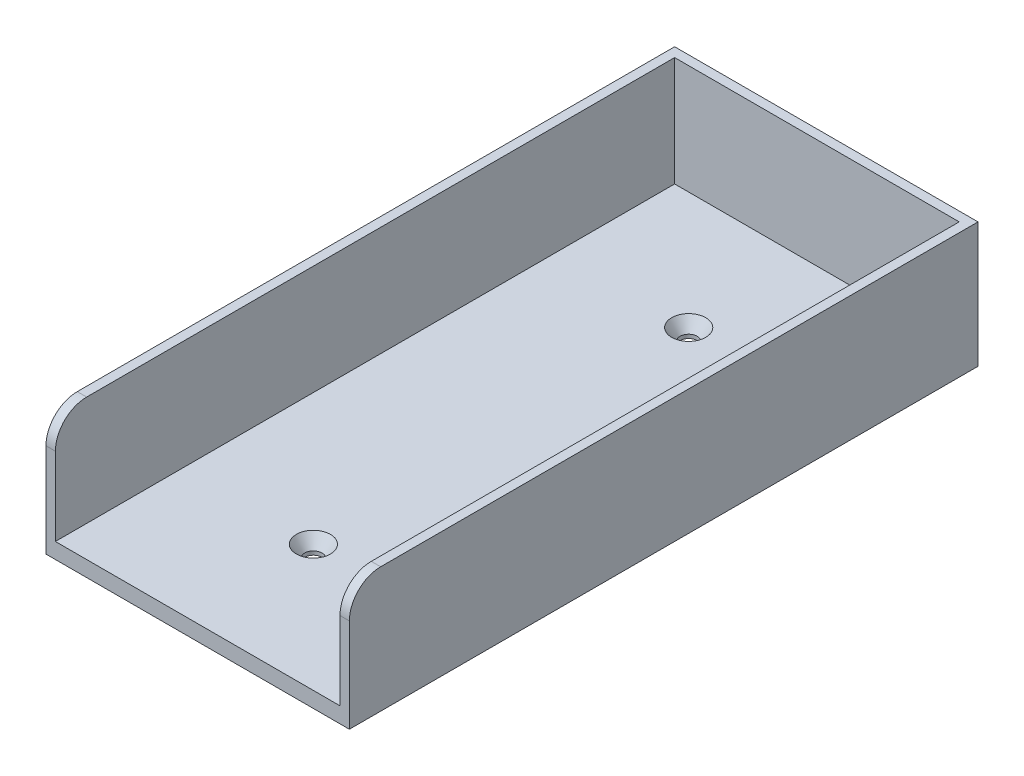
ISO-10303-21;
HEADER;
FILE_DESCRIPTION(('STEP AP214'),'2;1');
FILE_NAME('part.step','',(''),(''),'','','');
FILE_SCHEMA(('AUTOMOTIVE_DESIGN { 1 0 10303 214 1 1 1 1 }'));
ENDSEC;
DATA;
#1=APPLICATION_CONTEXT('core data for automotive mechanical design processes');
#2=APPLICATION_PROTOCOL_DEFINITION('international standard','automotive_design',2000,#1);
#3=PRODUCT_CONTEXT('',#1,'mechanical');
#4=PRODUCT('Part','Part','',(#3));
#5=PRODUCT_RELATED_PRODUCT_CATEGORY('part','',(#4));
#6=PRODUCT_DEFINITION_FORMATION('','',#4);
#7=PRODUCT_DEFINITION_CONTEXT('part definition',#1,'design');
#8=PRODUCT_DEFINITION('design','',#6,#7);
#9=PRODUCT_DEFINITION_SHAPE('','',#8);
#10=(LENGTH_UNIT() NAMED_UNIT(*) SI_UNIT(.MILLI.,.METRE.));
#11=(NAMED_UNIT(*) PLANE_ANGLE_UNIT() SI_UNIT($,.RADIAN.));
#12=(NAMED_UNIT(*) SI_UNIT($,.STERADIAN.) SOLID_ANGLE_UNIT());
#13=UNCERTAINTY_MEASURE_WITH_UNIT(LENGTH_MEASURE(1.E-05),#10,'distance_accuracy_value','');
#14=(GEOMETRIC_REPRESENTATION_CONTEXT(3) GLOBAL_UNCERTAINTY_ASSIGNED_CONTEXT((#13)) GLOBAL_UNIT_ASSIGNED_CONTEXT((#10,
#11,#12)) REPRESENTATION_CONTEXT('',''));
#15=CARTESIAN_POINT('',(0.,0.,0.));
#16=DIRECTION('',(0.,0.,1.));
#17=DIRECTION('',(1.,0.,0.));
#18=AXIS2_PLACEMENT_3D('',#15,#16,#17);
#19=CARTESIAN_POINT('',(45.5,35.,97.5));
#20=DIRECTION('',(1.,0.,0.));
#21=DIRECTION('',(0.,0.,-1.));
#22=AXIS2_PLACEMENT_3D('',#19,#20,#21);
#23=PLANE('',#22);
#24=DIRECTION('',(0.,-1.,0.));
#25=VECTOR('',#24,1.);
#26=CARTESIAN_POINT('',(45.5,35.,100.5));
#27=LINE('',#26,#25);
#28=CARTESIAN_POINT('',(45.5,25.,100.5));
#29=VERTEX_POINT('',#28);
#30=CARTESIAN_POINT('',(45.5,0.,100.5));
#31=VERTEX_POINT('',#30);
#32=EDGE_CURVE('E187',#29,#31,#27,.T.);
#33=ORIENTED_EDGE('',*,*,#32,.F.);
#34=CARTESIAN_POINT('',(45.5,25.,90.5));
#35=DIRECTION('',(1.,0.,0.));
#36=DIRECTION('',(0.,0.,-1.));
#37=AXIS2_PLACEMENT_3D('',#34,#35,#36);
#38=CIRCLE('',#37,10.);
#39=CARTESIAN_POINT('',(45.5,35.,90.5));
#40=VERTEX_POINT('',#39);
#41=EDGE_CURVE('E200',#29,#40,#38,.F.);
#42=ORIENTED_EDGE('',*,*,#41,.T.);
#43=DIRECTION('',(0.,0.,1.));
#44=VECTOR('',#43,1.);
#45=CARTESIAN_POINT('',(45.5,35.,97.5));
#46=LINE('',#45,#44);
#47=CARTESIAN_POINT('',(45.5,35.,-97.5));
#48=VERTEX_POINT('',#47);
#49=EDGE_CURVE('E155',#48,#40,#46,.T.);
#50=ORIENTED_EDGE('',*,*,#49,.F.);
#51=DIRECTION('',(0.,-1.,0.));
#52=VECTOR('',#51,1.);
#53=CARTESIAN_POINT('',(45.5,35.,-97.5));
#54=LINE('',#53,#52);
#55=CARTESIAN_POINT('',(45.5,0.,-97.5));
#56=VERTEX_POINT('',#55);
#57=EDGE_CURVE('E168',#48,#56,#54,.T.);
#58=ORIENTED_EDGE('',*,*,#57,.T.);
#59=DIRECTION('',(0.,0.,1.));
#60=VECTOR('',#59,1.);
#61=CARTESIAN_POINT('',(45.5,0.,97.5));
#62=LINE('',#61,#60);
#63=EDGE_CURVE('E153',#56,#31,#62,.T.);
#64=ORIENTED_EDGE('',*,*,#63,.T.);
#65=EDGE_LOOP('',(#33,#42,#50,#58,#64));
#66=FACE_BOUND('',#65,.T.);
#67=ADVANCED_FACE('F38',(#66),#23,.F.);
#68=CARTESIAN_POINT('',(48.5,35.,100.5));
#69=DIRECTION('',(-1.,0.,0.));
#70=DIRECTION('',(0.,0.,1.));
#71=AXIS2_PLACEMENT_3D('',#68,#69,#70);
#72=PLANE('',#71);
#73=DIRECTION('',(0.,0.,-1.));
#74=VECTOR('',#73,1.);
#75=CARTESIAN_POINT('',(48.5,35.,100.5));
#76=LINE('',#75,#74);
#77=CARTESIAN_POINT('',(48.5,35.,90.5));
#78=VERTEX_POINT('',#77);
#79=CARTESIAN_POINT('',(48.5,35.,-100.5));
#80=VERTEX_POINT('',#79);
#81=EDGE_CURVE('E158',#78,#80,#76,.T.);
#82=ORIENTED_EDGE('',*,*,#81,.F.);
#83=CARTESIAN_POINT('',(48.5,25.,90.5));
#84=DIRECTION('',(-1.,0.,0.));
#85=DIRECTION('',(0.,0.,1.));
#86=AXIS2_PLACEMENT_3D('',#83,#84,#85);
#87=CIRCLE('',#86,10.);
#88=CARTESIAN_POINT('',(48.5,25.,100.5));
#89=VERTEX_POINT('',#88);
#90=EDGE_CURVE('E195',#78,#89,#87,.F.);
#91=ORIENTED_EDGE('',*,*,#90,.T.);
#92=DIRECTION('',(0.,-1.,0.));
#93=VECTOR('',#92,1.);
#94=CARTESIAN_POINT('',(48.5,35.,100.5));
#95=LINE('',#94,#93);
#96=CARTESIAN_POINT('',(48.5,-5.,100.5));
#97=VERTEX_POINT('',#96);
#98=EDGE_CURVE('E185',#89,#97,#95,.T.);
#99=ORIENTED_EDGE('',*,*,#98,.T.);
#100=DIRECTION('',(0.,0.,1.));
#101=VECTOR('',#100,1.);
#102=CARTESIAN_POINT('',(48.5,-5.,100.5));
#103=LINE('',#102,#101);
#104=CARTESIAN_POINT('',(48.5,-5.,-100.5));
#105=VERTEX_POINT('',#104);
#106=EDGE_CURVE('E138',#105,#97,#103,.T.);
#107=ORIENTED_EDGE('',*,*,#106,.F.);
#108=DIRECTION('',(0.,-1.,0.));
#109=VECTOR('',#108,1.);
#110=CARTESIAN_POINT('',(48.5,35.,-100.5));
#111=LINE('',#110,#109);
#112=EDGE_CURVE('E128',#80,#105,#111,.T.);
#113=ORIENTED_EDGE('',*,*,#112,.F.);
#114=EDGE_LOOP('',(#82,#91,#99,#107,#113));
#115=FACE_BOUND('',#114,.T.);
#116=ADVANCED_FACE('F225',(#115),#72,.F.);
#117=CARTESIAN_POINT('',(-48.5,35.,-100.5));
#118=DIRECTION('',(0.,0.,1.));
#119=DIRECTION('',(1.,0.,0.));
#120=AXIS2_PLACEMENT_3D('',#117,#118,#119);
#121=PLANE('',#120);
#122=ORIENTED_EDGE('',*,*,#112,.T.);
#123=DIRECTION('',(1.,0.,0.));
#124=VECTOR('',#123,1.);
#125=CARTESIAN_POINT('',(-48.5,-5.,-100.5));
#126=LINE('',#125,#124);
#127=CARTESIAN_POINT('',(-48.5,-5.,-100.5));
#128=VERTEX_POINT('',#127);
#129=EDGE_CURVE('E132',#128,#105,#126,.T.);
#130=ORIENTED_EDGE('',*,*,#129,.F.);
#131=DIRECTION('',(0.,-1.,0.));
#132=VECTOR('',#131,1.);
#133=CARTESIAN_POINT('',(-48.5,35.,-100.5));
#134=LINE('',#133,#132);
#135=CARTESIAN_POINT('',(-48.5,35.,-100.5));
#136=VERTEX_POINT('',#135);
#137=EDGE_CURVE('E118',#136,#128,#134,.T.);
#138=ORIENTED_EDGE('',*,*,#137,.F.);
#139=DIRECTION('',(-1.,0.,0.));
#140=VECTOR('',#139,1.);
#141=CARTESIAN_POINT('',(-48.5,35.,-100.5));
#142=LINE('',#141,#140);
#143=EDGE_CURVE('E161',#80,#136,#142,.T.);
#144=ORIENTED_EDGE('',*,*,#143,.F.);
#145=EDGE_LOOP('',(#122,#130,#138,#144));
#146=FACE_BOUND('',#145,.T.);
#147=ADVANCED_FACE('F133',(#146),#121,.F.);
#148=CARTESIAN_POINT('',(-48.5,35.,100.5));
#149=DIRECTION('',(1.,0.,0.));
#150=DIRECTION('',(0.,0.,-1.));
#151=AXIS2_PLACEMENT_3D('',#148,#149,#150);
#152=PLANE('',#151);
#153=DIRECTION('',(0.,-1.,0.));
#154=VECTOR('',#153,1.);
#155=CARTESIAN_POINT('',(-48.5,35.,100.5));
#156=LINE('',#155,#154);
#157=CARTESIAN_POINT('',(-48.5,25.,100.5));
#158=VERTEX_POINT('',#157);
#159=CARTESIAN_POINT('',(-48.5,-5.,100.5));
#160=VERTEX_POINT('',#159);
#161=EDGE_CURVE('E129',#158,#160,#156,.T.);
#162=ORIENTED_EDGE('',*,*,#161,.F.);
#163=CARTESIAN_POINT('',(-48.5,25.,90.5));
#164=DIRECTION('',(1.,0.,0.));
#165=DIRECTION('',(0.,0.,-1.));
#166=AXIS2_PLACEMENT_3D('',#163,#164,#165);
#167=CIRCLE('',#166,10.);
#168=CARTESIAN_POINT('',(-48.5,35.,90.5));
#169=VERTEX_POINT('',#168);
#170=EDGE_CURVE('E203',#158,#169,#167,.F.);
#171=ORIENTED_EDGE('',*,*,#170,.T.);
#172=DIRECTION('',(0.,0.,1.));
#173=VECTOR('',#172,1.);
#174=CARTESIAN_POINT('',(-48.5,35.,100.5));
#175=LINE('',#174,#173);
#176=EDGE_CURVE('E125',#136,#169,#175,.T.);
#177=ORIENTED_EDGE('',*,*,#176,.F.);
#178=ORIENTED_EDGE('',*,*,#137,.T.);
#179=DIRECTION('',(0.,0.,-1.));
#180=VECTOR('',#179,1.);
#181=CARTESIAN_POINT('',(-48.5,-5.,100.5));
#182=LINE('',#181,#180);
#183=EDGE_CURVE('E123',#160,#128,#182,.T.);
#184=ORIENTED_EDGE('',*,*,#183,.F.);
#185=EDGE_LOOP('',(#162,#171,#177,#178,#184));
#186=FACE_BOUND('',#185,.T.);
#187=ADVANCED_FACE('F121',(#186),#152,.F.);
#188=CARTESIAN_POINT('',(-48.5,35.,100.5));
#189=DIRECTION('',(0.,0.,-1.));
#190=DIRECTION('',(-1.,0.,0.));
#191=AXIS2_PLACEMENT_3D('',#188,#189,#190);
#192=PLANE('',#191);
#193=ORIENTED_EDGE('',*,*,#98,.F.);
#194=DIRECTION('',(1.,0.,0.));
#195=VECTOR('',#194,1.);
#196=CARTESIAN_POINT('',(-48.5,25.,100.5));
#197=LINE('',#196,#195);
#198=EDGE_CURVE('E62',#89,#29,#197,.F.);
#199=ORIENTED_EDGE('',*,*,#198,.T.);
#200=ORIENTED_EDGE('',*,*,#32,.T.);
#201=DIRECTION('',(-1.,0.,0.));
#202=VECTOR('',#201,1.);
#203=CARTESIAN_POINT('',(-48.5,0.,100.5));
#204=LINE('',#203,#202);
#205=CARTESIAN_POINT('',(-45.5,0.,100.5));
#206=VERTEX_POINT('',#205);
#207=EDGE_CURVE('E144',#31,#206,#204,.T.);
#208=ORIENTED_EDGE('',*,*,#207,.T.);
#209=DIRECTION('',(0.,-1.,0.));
#210=VECTOR('',#209,1.);
#211=CARTESIAN_POINT('',(-45.5,35.,100.5));
#212=LINE('',#211,#210);
#213=CARTESIAN_POINT('',(-45.5,25.,100.5));
#214=VERTEX_POINT('',#213);
#215=EDGE_CURVE('E181',#214,#206,#212,.T.);
#216=ORIENTED_EDGE('',*,*,#215,.F.);
#217=DIRECTION('',(1.,0.,0.));
#218=VECTOR('',#217,1.);
#219=CARTESIAN_POINT('',(-48.5,25.,100.5));
#220=LINE('',#219,#218);
#221=EDGE_CURVE('E197',#214,#158,#220,.F.);
#222=ORIENTED_EDGE('',*,*,#221,.T.);
#223=ORIENTED_EDGE('',*,*,#161,.T.);
#224=DIRECTION('',(-1.,0.,0.));
#225=VECTOR('',#224,1.);
#226=CARTESIAN_POINT('',(-48.5,-5.,100.5));
#227=LINE('',#226,#225);
#228=EDGE_CURVE('E143',#97,#160,#227,.T.);
#229=ORIENTED_EDGE('',*,*,#228,.F.);
#230=EDGE_LOOP('',(#193,#199,#200,#208,#216,#222,#223,#229));
#231=FACE_BOUND('',#230,.T.);
#232=ADVANCED_FACE('F261',(#231),#192,.F.);
#233=CARTESIAN_POINT('',(-45.5,35.,97.5));
#234=DIRECTION('',(-1.,0.,0.));
#235=DIRECTION('',(0.,0.,1.));
#236=AXIS2_PLACEMENT_3D('',#233,#234,#235);
#237=PLANE('',#236);
#238=DIRECTION('',(0.,0.,-1.));
#239=VECTOR('',#238,1.);
#240=CARTESIAN_POINT('',(-45.5,35.,97.5));
#241=LINE('',#240,#239);
#242=CARTESIAN_POINT('',(-45.5,35.,90.5));
#243=VERTEX_POINT('',#242);
#244=CARTESIAN_POINT('',(-45.5,35.,-97.5));
#245=VERTEX_POINT('',#244);
#246=EDGE_CURVE('E164',#243,#245,#241,.T.);
#247=ORIENTED_EDGE('',*,*,#246,.F.);
#248=CARTESIAN_POINT('',(-45.5,25.,90.5));
#249=DIRECTION('',(-1.,0.,0.));
#250=DIRECTION('',(0.,0.,1.));
#251=AXIS2_PLACEMENT_3D('',#248,#249,#250);
#252=CIRCLE('',#251,10.);
#253=EDGE_CURVE('E54',#243,#214,#252,.F.);
#254=ORIENTED_EDGE('',*,*,#253,.T.);
#255=ORIENTED_EDGE('',*,*,#215,.T.);
#256=DIRECTION('',(0.,0.,-1.));
#257=VECTOR('',#256,1.);
#258=CARTESIAN_POINT('',(-45.5,0.,97.5));
#259=LINE('',#258,#257);
#260=CARTESIAN_POINT('',(-45.5,0.,-97.5));
#261=VERTEX_POINT('',#260);
#262=EDGE_CURVE('E171',#206,#261,#259,.T.);
#263=ORIENTED_EDGE('',*,*,#262,.T.);
#264=DIRECTION('',(0.,-1.,0.));
#265=VECTOR('',#264,1.);
#266=CARTESIAN_POINT('',(-45.5,35.,-97.5));
#267=LINE('',#266,#265);
#268=EDGE_CURVE('E178',#245,#261,#267,.T.);
#269=ORIENTED_EDGE('',*,*,#268,.F.);
#270=EDGE_LOOP('',(#247,#254,#255,#263,#269));
#271=FACE_BOUND('',#270,.T.);
#272=ADVANCED_FACE('F264',(#271),#237,.F.);
#273=CARTESIAN_POINT('',(-45.5,35.,-97.5));
#274=DIRECTION('',(0.,0.,-1.));
#275=DIRECTION('',(-1.,0.,0.));
#276=AXIS2_PLACEMENT_3D('',#273,#274,#275);
#277=PLANE('',#276);
#278=DIRECTION('',(1.,0.,0.));
#279=VECTOR('',#278,1.);
#280=CARTESIAN_POINT('',(-45.5,0.,-97.5));
#281=LINE('',#280,#279);
#282=EDGE_CURVE('E159',#261,#56,#281,.T.);
#283=ORIENTED_EDGE('',*,*,#282,.T.);
#284=ORIENTED_EDGE('',*,*,#57,.F.);
#285=DIRECTION('',(1.,0.,0.));
#286=VECTOR('',#285,1.);
#287=CARTESIAN_POINT('',(-45.5,35.,-97.5));
#288=LINE('',#287,#286);
#289=EDGE_CURVE('E166',#245,#48,#288,.T.);
#290=ORIENTED_EDGE('',*,*,#289,.F.);
#291=ORIENTED_EDGE('',*,*,#268,.T.);
#292=EDGE_LOOP('',(#283,#284,#290,#291));
#293=FACE_BOUND('',#292,.T.);
#294=ADVANCED_FACE('F269',(#293),#277,.F.);
#295=CARTESIAN_POINT('',(0.,35.,0.));
#296=DIRECTION('',(0.,-1.,0.));
#297=DIRECTION('',(0.,0.,-1.));
#298=AXIS2_PLACEMENT_3D('',#295,#296,#297);
#299=PLANE('',#298);
#300=ORIENTED_EDGE('',*,*,#49,.T.);
#301=DIRECTION('',(1.,0.,0.));
#302=VECTOR('',#301,1.);
#303=CARTESIAN_POINT('',(0.,35.,90.5));
#304=LINE('',#303,#302);
#305=EDGE_CURVE('E192',#40,#78,#304,.T.);
#306=ORIENTED_EDGE('',*,*,#305,.T.);
#307=ORIENTED_EDGE('',*,*,#81,.T.);
#308=ORIENTED_EDGE('',*,*,#143,.T.);
#309=ORIENTED_EDGE('',*,*,#176,.T.);
#310=DIRECTION('',(1.,0.,0.));
#311=VECTOR('',#310,1.);
#312=CARTESIAN_POINT('',(0.,35.,90.5));
#313=LINE('',#312,#311);
#314=EDGE_CURVE('E189',#169,#243,#313,.T.);
#315=ORIENTED_EDGE('',*,*,#314,.T.);
#316=ORIENTED_EDGE('',*,*,#246,.T.);
#317=ORIENTED_EDGE('',*,*,#289,.T.);
#318=EDGE_LOOP('',(#300,#306,#307,#308,#309,#315,#316,#317));
#319=FACE_BOUND('',#318,.T.);
#320=ADVANCED_FACE('F258',(#319),#299,.F.);
#321=CARTESIAN_POINT('',(0.,-5.,0.));
#322=DIRECTION('',(0.,-1.,0.));
#323=DIRECTION('',(0.,0.,-1.));
#324=AXIS2_PLACEMENT_3D('',#321,#322,#323);
#325=PLANE('',#324);
#326=CARTESIAN_POINT('',(-3.5,-5.,-60.));
#327=DIRECTION('',(0.,-1.,0.));
#328=DIRECTION('',(0.,0.,-1.));
#329=AXIS2_PLACEMENT_3D('',#326,#327,#328);
#330=CIRCLE('',#329,2.75);
#331=CARTESIAN_POINT('',(-3.5,-5.,-62.75));
#332=VERTEX_POINT('',#331);
#333=EDGE_CURVE('E147',#332,#332,#330,.T.);
#334=ORIENTED_EDGE('',*,*,#333,.F.);
#335=EDGE_LOOP('',(#334));
#336=FACE_BOUND('',#335,.T.);
#337=CARTESIAN_POINT('',(-3.49999999999999,-5.,60.));
#338=DIRECTION('',(0.,-1.,0.));
#339=DIRECTION('',(0.,0.,-1.));
#340=AXIS2_PLACEMENT_3D('',#337,#338,#339);
#341=CIRCLE('',#340,2.75);
#342=CARTESIAN_POINT('',(-3.49999999999999,-5.,57.25));
#343=VERTEX_POINT('',#342);
#344=EDGE_CURVE('E375',#343,#343,#341,.T.);
#345=ORIENTED_EDGE('',*,*,#344,.F.);
#346=EDGE_LOOP('',(#345));
#347=FACE_BOUND('',#346,.T.);
#348=ORIENTED_EDGE('',*,*,#183,.T.);
#349=ORIENTED_EDGE('',*,*,#129,.T.);
#350=ORIENTED_EDGE('',*,*,#106,.T.);
#351=ORIENTED_EDGE('',*,*,#228,.T.);
#352=EDGE_LOOP('',(#348,#349,#350,#351));
#353=FACE_BOUND('',#352,.T.);
#354=ADVANCED_FACE('F141',(#336,#347,#353),#325,.T.);
#355=CARTESIAN_POINT('',(0.,0.,0.));
#356=DIRECTION('',(0.,-1.,0.));
#357=DIRECTION('',(0.,0.,-1.));
#358=AXIS2_PLACEMENT_3D('',#355,#356,#357);
#359=PLANE('',#358);
#360=CARTESIAN_POINT('',(-3.5,0.,-60.));
#361=DIRECTION('',(0.,-1.,0.));
#362=DIRECTION('',(0.,0.,-1.));
#363=AXIS2_PLACEMENT_3D('',#360,#361,#362);
#364=CIRCLE('',#363,5.45000000000001);
#365=CARTESIAN_POINT('',(-3.5,0.,-54.55));
#366=VERTEX_POINT('',#365);
#367=EDGE_CURVE('E11',#366,#366,#364,.T.);
#368=ORIENTED_EDGE('',*,*,#367,.T.);
#369=EDGE_LOOP('',(#368));
#370=FACE_BOUND('',#369,.T.);
#371=CARTESIAN_POINT('',(-3.49999999999999,0.,60.));
#372=DIRECTION('',(0.,-1.,0.));
#373=DIRECTION('',(0.,0.,-1.));
#374=AXIS2_PLACEMENT_3D('',#371,#372,#373);
#375=CIRCLE('',#374,5.44999999999998);
#376=CARTESIAN_POINT('',(-3.49999999999999,0.,65.45));
#377=VERTEX_POINT('',#376);
#378=EDGE_CURVE('E208',#377,#377,#375,.T.);
#379=ORIENTED_EDGE('',*,*,#378,.T.);
#380=EDGE_LOOP('',(#379));
#381=FACE_BOUND('',#380,.T.);
#382=ORIENTED_EDGE('',*,*,#63,.F.);
#383=ORIENTED_EDGE('',*,*,#282,.F.);
#384=ORIENTED_EDGE('',*,*,#262,.F.);
#385=ORIENTED_EDGE('',*,*,#207,.F.);
#386=EDGE_LOOP('',(#382,#383,#384,#385));
#387=FACE_BOUND('',#386,.T.);
#388=ADVANCED_FACE('F239',(#370,#381,#387),#359,.F.);
#389=CARTESIAN_POINT('',(0.,25.,90.5));
#390=DIRECTION('',(1.,0.,0.));
#391=DIRECTION('',(0.,0.,-1.));
#392=AXIS2_PLACEMENT_3D('',#389,#390,#391);
#393=CYLINDRICAL_SURFACE('',#392,10.);
#394=ORIENTED_EDGE('',*,*,#41,.F.);
#395=ORIENTED_EDGE('',*,*,#198,.F.);
#396=ORIENTED_EDGE('',*,*,#90,.F.);
#397=ORIENTED_EDGE('',*,*,#305,.F.);
#398=EDGE_LOOP('',(#394,#395,#396,#397));
#399=FACE_BOUND('',#398,.T.);
#400=ADVANCED_FACE('F235',(#399),#393,.T.);
#401=CARTESIAN_POINT('',(0.,25.,90.5));
#402=DIRECTION('',(1.,0.,0.));
#403=DIRECTION('',(0.,0.,-1.));
#404=AXIS2_PLACEMENT_3D('',#401,#402,#403);
#405=CYLINDRICAL_SURFACE('',#404,10.);
#406=ORIENTED_EDGE('',*,*,#170,.F.);
#407=ORIENTED_EDGE('',*,*,#221,.F.);
#408=ORIENTED_EDGE('',*,*,#253,.F.);
#409=ORIENTED_EDGE('',*,*,#314,.F.);
#410=EDGE_LOOP('',(#406,#407,#408,#409));
#411=FACE_BOUND('',#410,.T.);
#412=ADVANCED_FACE('F238',(#411),#405,.T.);
#413=CARTESIAN_POINT('',(-3.49999999999999,-10.,60.));
#414=DIRECTION('',(0.,1.,0.));
#415=DIRECTION('',(0.,0.,1.));
#416=AXIS2_PLACEMENT_3D('',#413,#414,#415);
#417=CYLINDRICAL_SURFACE('',#416,2.75);
#418=CARTESIAN_POINT('',(-3.49999999999999,-3.79999999999995,60.));
#419=DIRECTION('',(0.,-1.,0.));
#420=DIRECTION('',(0.,0.,-1.));
#421=AXIS2_PLACEMENT_3D('',#418,#419,#420);
#422=CIRCLE('',#421,2.75);
#423=CARTESIAN_POINT('',(-3.49999999999999,-3.79999999999995,62.75));
#424=VERTEX_POINT('',#423);
#425=EDGE_CURVE('E205',#424,#424,#422,.F.);
#426=ORIENTED_EDGE('',*,*,#425,.T.);
#427=EDGE_LOOP('',(#426));
#428=FACE_BOUND('',#427,.T.);
#429=ORIENTED_EDGE('',*,*,#344,.T.);
#430=EDGE_LOOP('',(#429));
#431=FACE_BOUND('',#430,.T.);
#432=ADVANCED_FACE('F242',(#428,#431),#417,.F.);
#433=CARTESIAN_POINT('',(-3.5,-10.,-60.));
#434=DIRECTION('',(0.,1.,0.));
#435=DIRECTION('',(0.,0.,1.));
#436=AXIS2_PLACEMENT_3D('',#433,#434,#435);
#437=CYLINDRICAL_SURFACE('',#436,2.75);
#438=CARTESIAN_POINT('',(-3.5,-3.80000000000002,-60.));
#439=DIRECTION('',(0.,-1.,0.));
#440=DIRECTION('',(0.,0.,-1.));
#441=AXIS2_PLACEMENT_3D('',#438,#439,#440);
#442=CIRCLE('',#441,2.75);
#443=CARTESIAN_POINT('',(-3.5,-3.80000000000002,-57.25));
#444=VERTEX_POINT('',#443);
#445=EDGE_CURVE('E47',#444,#444,#442,.F.);
#446=ORIENTED_EDGE('',*,*,#445,.T.);
#447=EDGE_LOOP('',(#446));
#448=FACE_BOUND('',#447,.T.);
#449=ORIENTED_EDGE('',*,*,#333,.T.);
#450=EDGE_LOOP('',(#449));
#451=FACE_BOUND('',#450,.T.);
#452=ADVANCED_FACE('F213',(#448,#451),#437,.F.);
#453=CARTESIAN_POINT('',(-3.49999999999999,-3.79999999999995,60.));
#454=DIRECTION('',(0.,1.,0.));
#455=DIRECTION('',(0.,0.,1.));
#456=AXIS2_PLACEMENT_3D('',#453,#454,#455);
#457=CONICAL_SURFACE('',#456,2.75,0.617755725566236);
#458=CARTESIAN_POINT('',(-3.49999999999999,0.,65.45));
#459=CARTESIAN_POINT('',(-3.49999999999999,-0.0395833333333321,65.421875));
#460=CARTESIAN_POINT('',(-3.49999999999999,-0.0791666666666649,65.39375));
#461=CARTESIAN_POINT('',(-3.49999999999999,-0.158333333333331,65.3375));
#462=CARTESIAN_POINT('',(-3.49999999999999,-0.197916666666664,65.309375));
#463=CARTESIAN_POINT('',(-3.49999999999999,-0.277083333333329,65.253125));
#464=CARTESIAN_POINT('',(-3.49999999999999,-0.316666666666661,65.225));
#465=CARTESIAN_POINT('',(-3.49999999999999,-0.395833333333328,65.16875));
#466=CARTESIAN_POINT('',(-3.49999999999999,-0.435416666666662,65.140625));
#467=CARTESIAN_POINT('',(-3.49999999999999,-0.514583333333327,65.084375));
#468=CARTESIAN_POINT('',(-3.49999999999999,-0.554166666666658,65.05625));
#469=CARTESIAN_POINT('',(-3.49999999999999,-0.633333333333323,65.));
#470=CARTESIAN_POINT('',(-3.49999999999999,-0.672916666666657,64.971875));
#471=CARTESIAN_POINT('',(-3.49999999999999,-0.752083333333323,64.915625));
#472=CARTESIAN_POINT('',(-3.49999999999999,-0.791666666666655,64.8875));
#473=CARTESIAN_POINT('',(-3.49999999999999,-0.870833333333321,64.83125));
#474=CARTESIAN_POINT('',(-3.49999999999999,-0.910416666666653,64.803125));
#475=CARTESIAN_POINT('',(-3.49999999999999,-0.989583333333319,64.746875));
#476=CARTESIAN_POINT('',(-3.49999999999999,-1.02916666666665,64.71875));
#477=CARTESIAN_POINT('',(-3.49999999999999,-1.10833333333332,64.6625));
#478=CARTESIAN_POINT('',(-3.49999999999999,-1.14791666666665,64.634375));
#479=CARTESIAN_POINT('',(-3.49999999999999,-1.22708333333332,64.578125));
#480=CARTESIAN_POINT('',(-3.49999999999999,-1.26666666666665,64.55));
#481=CARTESIAN_POINT('',(-3.49999999999999,-1.34583333333332,64.49375));
#482=CARTESIAN_POINT('',(-3.49999999999999,-1.38541666666665,64.465625));
#483=CARTESIAN_POINT('',(-3.49999999999999,-1.46458333333331,64.409375));
#484=CARTESIAN_POINT('',(-3.49999999999999,-1.50416666666664,64.38125));
#485=CARTESIAN_POINT('',(-3.49999999999999,-1.58333333333331,64.325));
#486=CARTESIAN_POINT('',(-3.49999999999999,-1.62291666666664,64.296875));
#487=CARTESIAN_POINT('',(-3.49999999999999,-1.70208333333331,64.240625));
#488=CARTESIAN_POINT('',(-3.49999999999999,-1.74166666666664,64.2125));
#489=CARTESIAN_POINT('',(-3.49999999999999,-1.82083333333331,64.15625));
#490=CARTESIAN_POINT('',(-3.49999999999999,-1.86041666666664,64.128125));
#491=CARTESIAN_POINT('',(-3.49999999999999,-1.93958333333331,64.071875));
#492=CARTESIAN_POINT('',(-3.49999999999999,-1.97916666666664,64.04375));
#493=CARTESIAN_POINT('',(-3.49999999999999,-2.0583333333333,63.9875));
#494=CARTESIAN_POINT('',(-3.49999999999999,-2.09791666666664,63.959375));
#495=CARTESIAN_POINT('',(-3.49999999999999,-2.1770833333333,63.903125));
#496=CARTESIAN_POINT('',(-3.49999999999999,-2.21666666666664,63.875));
#497=CARTESIAN_POINT('',(-3.49999999999999,-2.2958333333333,63.81875));
#498=CARTESIAN_POINT('',(-3.49999999999999,-2.33541666666663,63.790625));
#499=CARTESIAN_POINT('',(-3.49999999999999,-2.4145833333333,63.734375));
#500=CARTESIAN_POINT('',(-3.49999999999999,-2.45416666666663,63.70625));
#501=CARTESIAN_POINT('',(-3.49999999999999,-2.5333333333333,63.65));
#502=CARTESIAN_POINT('',(-3.49999999999999,-2.57291666666663,63.621875));
#503=CARTESIAN_POINT('',(-3.49999999999999,-2.6520833333333,63.565625));
#504=CARTESIAN_POINT('',(-3.49999999999999,-2.69166666666663,63.5375));
#505=CARTESIAN_POINT('',(-3.49999999999999,-2.77083333333329,63.48125));
#506=CARTESIAN_POINT('',(-3.49999999999999,-2.81041666666663,63.453125));
#507=CARTESIAN_POINT('',(-3.49999999999999,-2.88958333333329,63.396875));
#508=CARTESIAN_POINT('',(-3.49999999999999,-2.92916666666662,63.36875));
#509=CARTESIAN_POINT('',(-3.49999999999999,-3.00833333333329,63.3125));
#510=CARTESIAN_POINT('',(-3.49999999999999,-3.04791666666662,63.284375));
#511=CARTESIAN_POINT('',(-3.49999999999999,-3.12708333333329,63.228125));
#512=CARTESIAN_POINT('',(-3.49999999999999,-3.16666666666662,63.2));
#513=CARTESIAN_POINT('',(-3.49999999999999,-3.24583333333329,63.14375));
#514=CARTESIAN_POINT('',(-3.49999999999999,-3.28541666666662,63.115625));
#515=CARTESIAN_POINT('',(-3.49999999999999,-3.36458333333328,63.059375));
#516=CARTESIAN_POINT('',(-3.49999999999999,-3.40416666666662,63.03125));
#517=CARTESIAN_POINT('',(-3.49999999999999,-3.48333333333328,62.975));
#518=CARTESIAN_POINT('',(-3.49999999999999,-3.52291666666662,62.946875));
#519=CARTESIAN_POINT('',(-3.49999999999999,-3.60208333333328,62.890625));
#520=CARTESIAN_POINT('',(-3.49999999999999,-3.64166666666662,62.8625));
#521=CARTESIAN_POINT('',(-3.49999999999999,-3.72083333333328,62.80625));
#522=CARTESIAN_POINT('',(-3.49999999999999,-3.76041666666661,62.778125));
#523=CARTESIAN_POINT('',(-3.49999999999999,-3.79999999999995,62.75));
#524=B_SPLINE_CURVE_WITH_KNOTS('',3,(#458,#459,#460,#461,#462,#463,#464,#465,#466,#467,#468,
#469,#470,#471,#472,#473,#474,#475,#476,#477,#478,#479,#480,#481,#482,#483,#484,#485,#486,#487,
#488,#489,#490,#491,#492,#493,#494,#495,#496,#497,#498,#499,#500,#501,#502,#503,#504,#505,#506,
#507,#508,#509,#510,#511,#512,#513,#514,#515,#516,#517,#518,#519,#520,#521,#522,#523),
.UNSPECIFIED.,.F.,.F.,(4,2,2,2,2,2,2,2,2,2,2,2,2,2,2,2,2,2,2,2,2,2,2,2,2,2,2,2,2,2,2,2,4),(0.,
0.14567327526008,0.291346550520161,0.437019825780242,0.582693101040323,0.728366376300411,
0.874039651560492,1.01971292682057,1.16538620208065,1.31105947734073,1.45673275260081,
1.60240602786089,1.74807930312098,1.89375257838106,2.03942585364114,2.18509912890122,
2.33077240416131,2.47644567942139,2.62211895468147,2.76779222994155,2.91346550520164,
3.05913878046172,3.2048120557218,3.35048533098188,3.49615860624196,3.64183188150204,
3.78750515676212,3.9331784320222,4.07885170728229,4.22452498254237,4.37019825780245,
4.51587153306253,4.66154480832261),.UNSPECIFIED.);
#525=EDGE_CURVE('BSEAM217',#377,#424,#524,.T.);
#526=ORIENTED_EDGE('',*,*,#378,.F.);
#527=ORIENTED_EDGE('',*,*,#425,.F.);
#528=ORIENTED_EDGE('',*,*,#525,.T.);
#529=ORIENTED_EDGE('',*,*,#525,.F.);
#530=EDGE_LOOP('',(#526,#528,#527,#529));
#531=FACE_BOUND('',#530,.T.);
#532=ADVANCED_FACE('F217',(#531),#457,.F.);
#533=CARTESIAN_POINT('',(-3.5,-3.80000000000002,-60.));
#534=DIRECTION('',(0.,1.,0.));
#535=DIRECTION('',(0.,0.,1.));
#536=AXIS2_PLACEMENT_3D('',#533,#534,#535);
#537=CONICAL_SURFACE('',#536,2.75,0.617755725566232);
#538=CARTESIAN_POINT('',(-3.5,0.,-54.55));
#539=CARTESIAN_POINT('',(-3.5,-0.0395833333333349,-54.578125));
#540=CARTESIAN_POINT('',(-3.5,-0.0791666666666679,-54.60625));
#541=CARTESIAN_POINT('',(-3.5,-0.158333333333334,-54.6625));
#542=CARTESIAN_POINT('',(-3.5,-0.197916666666667,-54.690625));
#543=CARTESIAN_POINT('',(-3.5,-0.277083333333334,-54.746875));
#544=CARTESIAN_POINT('',(-3.5,-0.316666666666669,-54.775));
#545=CARTESIAN_POINT('',(-3.5,-0.395833333333336,-54.83125));
#546=CARTESIAN_POINT('',(-3.5,-0.435416666666668,-54.859375));
#547=CARTESIAN_POINT('',(-3.5,-0.514583333333335,-54.915625));
#548=CARTESIAN_POINT('',(-3.5,-0.554166666666669,-54.94375));
#549=CARTESIAN_POINT('',(-3.5,-0.633333333333337,-55.));
#550=CARTESIAN_POINT('',(-3.5,-0.67291666666667,-55.028125));
#551=CARTESIAN_POINT('',(-3.5,-0.752083333333338,-55.084375));
#552=CARTESIAN_POINT('',(-3.5,-0.791666666666672,-55.1125));
#553=CARTESIAN_POINT('',(-3.5,-0.870833333333338,-55.16875));
#554=CARTESIAN_POINT('',(-3.5,-0.910416666666671,-55.196875));
#555=CARTESIAN_POINT('',(-3.5,-0.989583333333338,-55.253125));
#556=CARTESIAN_POINT('',(-3.5,-1.02916666666667,-55.28125));
#557=CARTESIAN_POINT('',(-3.5,-1.10833333333334,-55.3375));
#558=CARTESIAN_POINT('',(-3.5,-1.14791666666667,-55.365625));
#559=CARTESIAN_POINT('',(-3.5,-1.22708333333334,-55.421875));
#560=CARTESIAN_POINT('',(-3.5,-1.26666666666667,-55.45));
#561=CARTESIAN_POINT('',(-3.5,-1.34583333333334,-55.50625));
#562=CARTESIAN_POINT('',(-3.5,-1.38541666666668,-55.534375));
#563=CARTESIAN_POINT('',(-3.5,-1.46458333333334,-55.590625));
#564=CARTESIAN_POINT('',(-3.5,-1.50416666666667,-55.61875));
#565=CARTESIAN_POINT('',(-3.5,-1.58333333333334,-55.675));
#566=CARTESIAN_POINT('',(-3.5,-1.62291666666668,-55.703125));
#567=CARTESIAN_POINT('',(-3.5,-1.70208333333334,-55.759375));
#568=CARTESIAN_POINT('',(-3.5,-1.74166666666668,-55.7875));
#569=CARTESIAN_POINT('',(-3.5,-1.82083333333334,-55.84375));
#570=CARTESIAN_POINT('',(-3.5,-1.86041666666668,-55.871875));
#571=CARTESIAN_POINT('',(-3.5,-1.93958333333334,-55.928125));
#572=CARTESIAN_POINT('',(-3.5,-1.97916666666668,-55.95625));
#573=CARTESIAN_POINT('',(-3.5,-2.05833333333334,-56.0125));
#574=CARTESIAN_POINT('',(-3.5,-2.09791666666668,-56.040625));
#575=CARTESIAN_POINT('',(-3.5,-2.17708333333335,-56.096875));
#576=CARTESIAN_POINT('',(-3.5,-2.21666666666668,-56.125));
#577=CARTESIAN_POINT('',(-3.5,-2.29583333333335,-56.18125));
#578=CARTESIAN_POINT('',(-3.5,-2.33541666666668,-56.209375));
#579=CARTESIAN_POINT('',(-3.5,-2.41458333333335,-56.265625));
#580=CARTESIAN_POINT('',(-3.5,-2.45416666666668,-56.29375));
#581=CARTESIAN_POINT('',(-3.5,-2.53333333333335,-56.35));
#582=CARTESIAN_POINT('',(-3.5,-2.57291666666668,-56.378125));
#583=CARTESIAN_POINT('',(-3.5,-2.65208333333335,-56.434375));
#584=CARTESIAN_POINT('',(-3.5,-2.69166666666668,-56.4625));
#585=CARTESIAN_POINT('',(-3.5,-2.77083333333335,-56.51875));
#586=CARTESIAN_POINT('',(-3.5,-2.81041666666668,-56.546875));
#587=CARTESIAN_POINT('',(-3.5,-2.88958333333335,-56.603125));
#588=CARTESIAN_POINT('',(-3.5,-2.92916666666668,-56.63125));
#589=CARTESIAN_POINT('',(-3.5,-3.00833333333335,-56.6875));
#590=CARTESIAN_POINT('',(-3.5,-3.04791666666668,-56.715625));
#591=CARTESIAN_POINT('',(-3.5,-3.12708333333335,-56.771875));
#592=CARTESIAN_POINT('',(-3.5,-3.16666666666669,-56.8));
#593=CARTESIAN_POINT('',(-3.5,-3.24583333333335,-56.85625));
#594=CARTESIAN_POINT('',(-3.5,-3.28541666666668,-56.884375));
#595=CARTESIAN_POINT('',(-3.5,-3.36458333333335,-56.940625));
#596=CARTESIAN_POINT('',(-3.5,-3.40416666666669,-56.96875));
#597=CARTESIAN_POINT('',(-3.5,-3.48333333333335,-57.025));
#598=CARTESIAN_POINT('',(-3.5,-3.52291666666669,-57.053125));
#599=CARTESIAN_POINT('',(-3.5,-3.60208333333335,-57.109375));
#600=CARTESIAN_POINT('',(-3.5,-3.64166666666669,-57.1375));
#601=CARTESIAN_POINT('',(-3.5,-3.72083333333335,-57.19375));
#602=CARTESIAN_POINT('',(-3.5,-3.76041666666669,-57.221875));
#603=CARTESIAN_POINT('',(-3.5,-3.80000000000002,-57.25));
#604=B_SPLINE_CURVE_WITH_KNOTS('',3,(#538,#539,#540,#541,#542,#543,#544,#545,#546,#547,#548,
#549,#550,#551,#552,#553,#554,#555,#556,#557,#558,#559,#560,#561,#562,#563,#564,#565,#566,#567,
#568,#569,#570,#571,#572,#573,#574,#575,#576,#577,#578,#579,#580,#581,#582,#583,#584,#585,#586,
#587,#588,#589,#590,#591,#592,#593,#594,#595,#596,#597,#598,#599,#600,#601,#602,#603),
.UNSPECIFIED.,.F.,.F.,(4,2,2,2,2,2,2,2,2,2,2,2,2,2,2,2,2,2,2,2,2,2,2,2,2,2,2,2,2,2,2,2,4),(0.,
0.145673275260083,0.291346550520169,0.437019825780251,0.582693101040338,0.728366376300421,
0.874039651560503,1.01971292682059,1.16538620208067,1.31105947734075,1.45673275260084,
1.60240602786092,1.74807930312101,1.89375257838109,2.03942585364118,2.18509912890126,
2.33077240416134,2.47644567942143,2.62211895468151,2.7677922299416,2.91346550520168,
3.05913878046177,3.20481205572185,3.35048533098193,3.49615860624202,3.6418318815021,
3.78750515676219,3.93317843202227,4.07885170728235,4.22452498254244,4.37019825780252,
4.51587153306261,4.66154480832269),.UNSPECIFIED.);
#605=EDGE_CURVE('BSEAM41',#366,#444,#604,.T.);
#606=ORIENTED_EDGE('',*,*,#367,.F.);
#607=ORIENTED_EDGE('',*,*,#445,.F.);
#608=ORIENTED_EDGE('',*,*,#605,.T.);
#609=ORIENTED_EDGE('',*,*,#605,.F.);
#610=EDGE_LOOP('',(#606,#608,#607,#609));
#611=FACE_BOUND('',#610,.T.);
#612=ADVANCED_FACE('F41',(#611),#537,.F.);
#613=CLOSED_SHELL('',(#67,#116,#147,#187,#232,#272,#294,#320,#354,#388,#400,#412,#432,#452,#532,#612));
#614=MANIFOLD_SOLID_BREP('B2',#613);
#615=ADVANCED_BREP_SHAPE_REPRESENTATION('',(#18,#614),#14);
#616=SHAPE_DEFINITION_REPRESENTATION(#9,#615);
ENDSEC;
END-ISO-10303-21;
